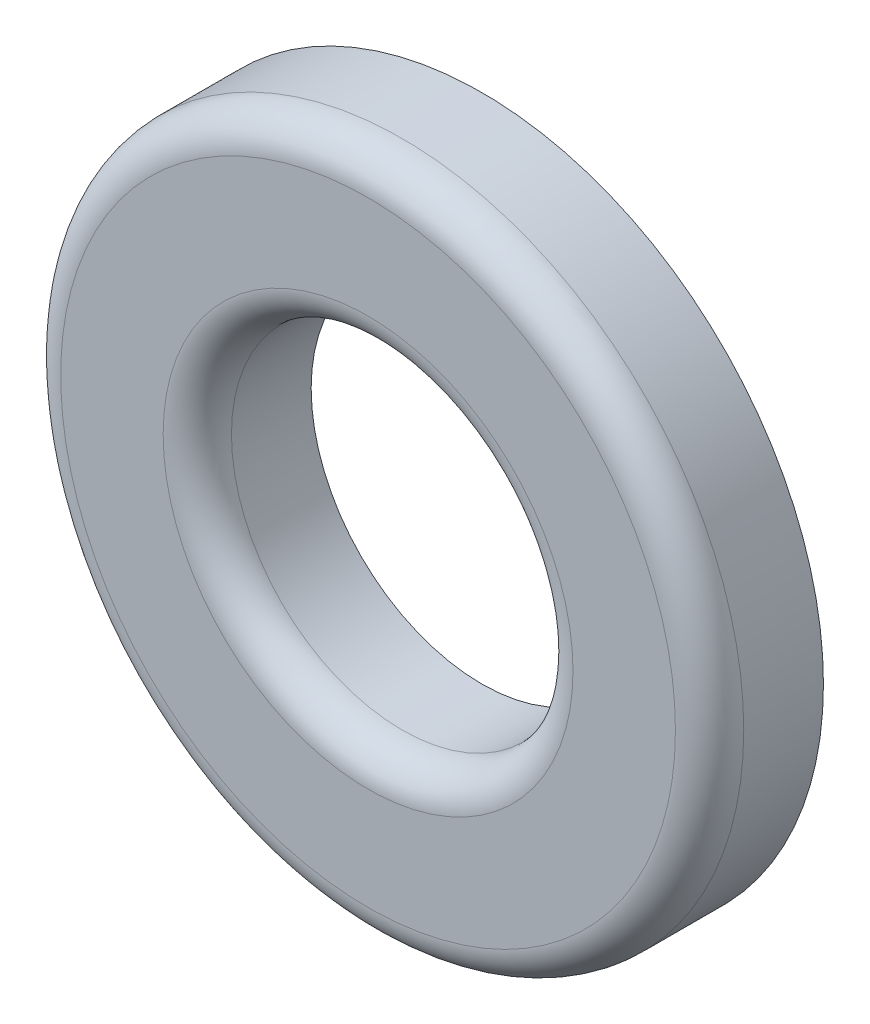
ISO-10303-21;
HEADER;
FILE_DESCRIPTION(('STEP AP214'),'2;1');
FILE_NAME('part.step','',(''),(''),'','','');
FILE_SCHEMA(('AUTOMOTIVE_DESIGN { 1 0 10303 214 1 1 1 1 }'));
ENDSEC;
DATA;
#1=APPLICATION_CONTEXT('core data for automotive mechanical design processes');
#2=APPLICATION_PROTOCOL_DEFINITION('international standard','automotive_design',2000,#1);
#3=PRODUCT_CONTEXT('',#1,'mechanical');
#4=PRODUCT('Part','Part','',(#3));
#5=PRODUCT_RELATED_PRODUCT_CATEGORY('part','',(#4));
#6=PRODUCT_DEFINITION_FORMATION('','',#4);
#7=PRODUCT_DEFINITION_CONTEXT('part definition',#1,'design');
#8=PRODUCT_DEFINITION('design','',#6,#7);
#9=PRODUCT_DEFINITION_SHAPE('','',#8);
#10=(LENGTH_UNIT() NAMED_UNIT(*) SI_UNIT(.MILLI.,.METRE.));
#11=(NAMED_UNIT(*) PLANE_ANGLE_UNIT() SI_UNIT($,.RADIAN.));
#12=(NAMED_UNIT(*) SI_UNIT($,.STERADIAN.) SOLID_ANGLE_UNIT());
#13=UNCERTAINTY_MEASURE_WITH_UNIT(LENGTH_MEASURE(1.E-05),#10,'distance_accuracy_value','');
#14=(GEOMETRIC_REPRESENTATION_CONTEXT(3) GLOBAL_UNCERTAINTY_ASSIGNED_CONTEXT((#13)) GLOBAL_UNIT_ASSIGNED_CONTEXT((#10,
#11,#12)) REPRESENTATION_CONTEXT('',''));
#15=CARTESIAN_POINT('',(0.,0.,0.));
#16=DIRECTION('',(0.,0.,1.));
#17=DIRECTION('',(1.,0.,0.));
#18=AXIS2_PLACEMENT_3D('',#15,#16,#17);
#19=CARTESIAN_POINT('',(0.,0.,10.));
#20=DIRECTION('',(0.,0.,1.));
#21=DIRECTION('',(1.,0.,0.));
#22=AXIS2_PLACEMENT_3D('',#19,#20,#21);
#23=PLANE('',#22);
#24=CARTESIAN_POINT('',(0.,0.,10.));
#25=DIRECTION('',(0.,0.,1.));
#26=DIRECTION('',(1.,0.,0.));
#27=AXIS2_PLACEMENT_3D('',#24,#25,#26);
#28=CIRCLE('',#27,18.);
#29=CARTESIAN_POINT('',(18.,0.,10.));
#30=VERTEX_POINT('',#29);
#31=EDGE_CURVE('E43',#30,#30,#28,.F.);
#32=ORIENTED_EDGE('',*,*,#31,.T.);
#33=EDGE_LOOP('',(#32));
#34=FACE_BOUND('',#33,.T.);
#35=CARTESIAN_POINT('',(0.,0.,10.));
#36=DIRECTION('',(0.,0.,1.));
#37=DIRECTION('',(1.,0.,0.));
#38=AXIS2_PLACEMENT_3D('',#35,#36,#37);
#39=CIRCLE('',#38,27.);
#40=CARTESIAN_POINT('',(27.,0.,10.));
#41=VERTEX_POINT('',#40);
#42=EDGE_CURVE('E47',#41,#41,#39,.T.);
#43=ORIENTED_EDGE('',*,*,#42,.T.);
#44=EDGE_LOOP('',(#43));
#45=FACE_BOUND('',#44,.T.);
#46=ADVANCED_FACE('F36',(#34,#45),#23,.T.);
#47=CARTESIAN_POINT('',(0.,0.,0.));
#48=DIRECTION('',(0.,0.,1.));
#49=DIRECTION('',(1.,0.,0.));
#50=AXIS2_PLACEMENT_3D('',#47,#48,#49);
#51=PLANE('',#50);
#52=CARTESIAN_POINT('',(0.,0.,0.));
#53=DIRECTION('',(0.,0.,1.));
#54=DIRECTION('',(1.,0.,0.));
#55=AXIS2_PLACEMENT_3D('',#52,#53,#54);
#56=CIRCLE('',#55,30.);
#57=CARTESIAN_POINT('',(30.,0.,0.));
#58=VERTEX_POINT('',#57);
#59=EDGE_CURVE('E56',#58,#58,#56,.T.);
#60=ORIENTED_EDGE('',*,*,#59,.F.);
#61=EDGE_LOOP('',(#60));
#62=FACE_BOUND('',#61,.T.);
#63=CARTESIAN_POINT('',(0.,0.,0.));
#64=DIRECTION('',(0.,0.,1.));
#65=DIRECTION('',(1.,0.,0.));
#66=AXIS2_PLACEMENT_3D('',#63,#64,#65);
#67=CIRCLE('',#66,15.);
#68=CARTESIAN_POINT('',(15.,0.,0.));
#69=VERTEX_POINT('',#68);
#70=EDGE_CURVE('E59',#69,#69,#67,.T.);
#71=ORIENTED_EDGE('',*,*,#70,.T.);
#72=EDGE_LOOP('',(#71));
#73=FACE_BOUND('',#72,.T.);
#74=ADVANCED_FACE('F63',(#62,#73),#51,.F.);
#75=CARTESIAN_POINT('',(0.,0.,10.));
#76=DIRECTION('',(0.,0.,-1.));
#77=DIRECTION('',(-1.,0.,0.));
#78=AXIS2_PLACEMENT_3D('',#75,#76,#77);
#79=CYLINDRICAL_SURFACE('',#78,30.);
#80=CARTESIAN_POINT('',(0.,0.,7.));
#81=DIRECTION('',(0.,0.,1.));
#82=DIRECTION('',(1.,0.,0.));
#83=AXIS2_PLACEMENT_3D('',#80,#81,#82);
#84=CIRCLE('',#83,30.);
#85=CARTESIAN_POINT('',(30.,0.,7.));
#86=VERTEX_POINT('',#85);
#87=EDGE_CURVE('E11',#86,#86,#84,.F.);
#88=ORIENTED_EDGE('',*,*,#87,.T.);
#89=EDGE_LOOP('',(#88));
#90=FACE_BOUND('',#89,.T.);
#91=ORIENTED_EDGE('',*,*,#59,.T.);
#92=EDGE_LOOP('',(#91));
#93=FACE_BOUND('',#92,.T.);
#94=ADVANCED_FACE('F68',(#90,#93),#79,.T.);
#95=CARTESIAN_POINT('',(0.,0.,10.));
#96=DIRECTION('',(0.,0.,-1.));
#97=DIRECTION('',(-1.,0.,0.));
#98=AXIS2_PLACEMENT_3D('',#95,#96,#97);
#99=CYLINDRICAL_SURFACE('',#98,15.);
#100=CARTESIAN_POINT('',(0.,0.,7.));
#101=DIRECTION('',(0.,0.,1.));
#102=DIRECTION('',(1.,0.,0.));
#103=AXIS2_PLACEMENT_3D('',#100,#101,#102);
#104=CIRCLE('',#103,15.);
#105=CARTESIAN_POINT('',(15.,0.,7.));
#106=VERTEX_POINT('',#105);
#107=EDGE_CURVE('E51',#106,#106,#104,.T.);
#108=ORIENTED_EDGE('',*,*,#107,.T.);
#109=EDGE_LOOP('',(#108));
#110=FACE_BOUND('',#109,.T.);
#111=ORIENTED_EDGE('',*,*,#70,.F.);
#112=EDGE_LOOP('',(#111));
#113=FACE_BOUND('',#112,.T.);
#114=ADVANCED_FACE('F65',(#110,#113),#99,.F.);
#115=CARTESIAN_POINT('',(0.,0.,7.));
#116=DIRECTION('',(0.,0.,1.));
#117=DIRECTION('',(1.,0.,0.));
#118=AXIS2_PLACEMENT_3D('',#115,#116,#117);
#119=TOROIDAL_SURFACE('',#118,18.,3.);
#120=ORIENTED_EDGE('',*,*,#31,.F.);
#121=EDGE_LOOP('',(#120));
#122=FACE_BOUND('',#121,.T.);
#123=ORIENTED_EDGE('',*,*,#107,.F.);
#124=EDGE_LOOP('',(#123));
#125=FACE_BOUND('',#124,.T.);
#126=ADVANCED_FACE('F67',(#122,#125),#119,.T.);
#127=CARTESIAN_POINT('',(0.,0.,7.));
#128=DIRECTION('',(0.,0.,1.));
#129=DIRECTION('',(1.,0.,0.));
#130=AXIS2_PLACEMENT_3D('',#127,#128,#129);
#131=TOROIDAL_SURFACE('',#130,27.,3.);
#132=ORIENTED_EDGE('',*,*,#87,.F.);
#133=EDGE_LOOP('',(#132));
#134=FACE_BOUND('',#133,.T.);
#135=ORIENTED_EDGE('',*,*,#42,.F.);
#136=EDGE_LOOP('',(#135));
#137=FACE_BOUND('',#136,.T.);
#138=ADVANCED_FACE('F38',(#134,#137),#131,.T.);
#139=CLOSED_SHELL('',(#46,#74,#94,#114,#126,#138));
#140=MANIFOLD_SOLID_BREP('B2',#139);
#141=ADVANCED_BREP_SHAPE_REPRESENTATION('',(#18,#140),#14);
#142=SHAPE_DEFINITION_REPRESENTATION(#9,#141);
ENDSEC;
END-ISO-10303-21;
